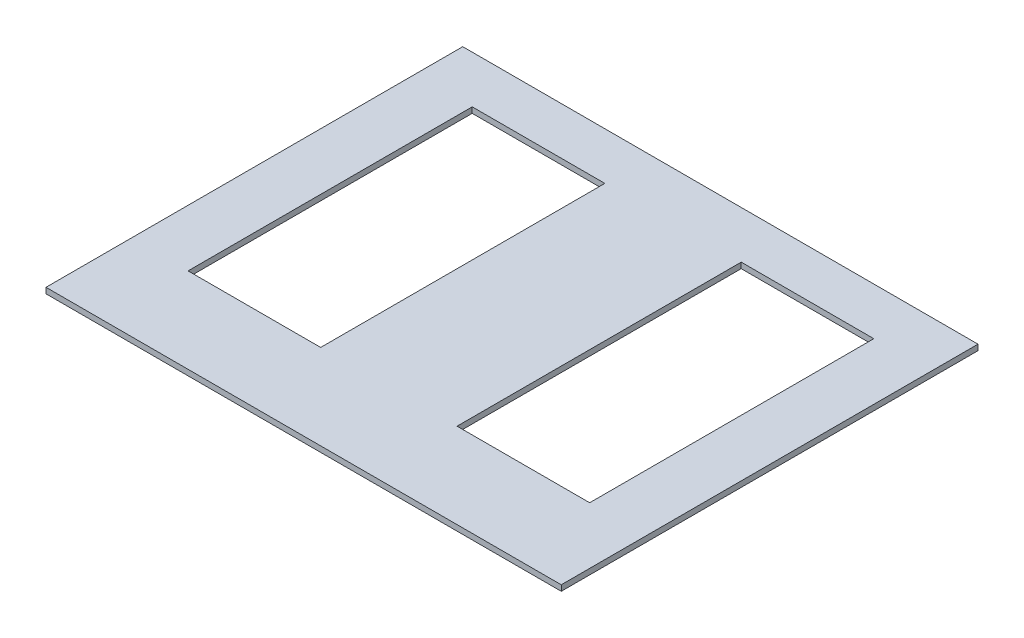
ISO-10303-21;
HEADER;
FILE_DESCRIPTION(('STEP AP214'),'2;1');
FILE_NAME('part.step','',(''),(''),'','','');
FILE_SCHEMA(('AUTOMOTIVE_DESIGN { 1 0 10303 214 1 1 1 1 }'));
ENDSEC;
DATA;
#1=APPLICATION_CONTEXT('core data for automotive mechanical design processes');
#2=APPLICATION_PROTOCOL_DEFINITION('international standard','automotive_design',2000,#1);
#3=PRODUCT_CONTEXT('',#1,'mechanical');
#4=PRODUCT('Part','Part','',(#3));
#5=PRODUCT_RELATED_PRODUCT_CATEGORY('part','',(#4));
#6=PRODUCT_DEFINITION_FORMATION('','',#4);
#7=PRODUCT_DEFINITION_CONTEXT('part definition',#1,'design');
#8=PRODUCT_DEFINITION('design','',#6,#7);
#9=PRODUCT_DEFINITION_SHAPE('','',#8);
#10=(LENGTH_UNIT() NAMED_UNIT(*) SI_UNIT(.MILLI.,.METRE.));
#11=(NAMED_UNIT(*) PLANE_ANGLE_UNIT() SI_UNIT($,.RADIAN.));
#12=(NAMED_UNIT(*) SI_UNIT($,.STERADIAN.) SOLID_ANGLE_UNIT());
#13=UNCERTAINTY_MEASURE_WITH_UNIT(LENGTH_MEASURE(1.E-05),#10,'distance_accuracy_value','');
#14=(GEOMETRIC_REPRESENTATION_CONTEXT(3) GLOBAL_UNCERTAINTY_ASSIGNED_CONTEXT((#13)) GLOBAL_UNIT_ASSIGNED_CONTEXT((#10,
#11,#12)) REPRESENTATION_CONTEXT('',''));
#15=CARTESIAN_POINT('',(0.,0.,0.));
#16=DIRECTION('',(0.,0.,1.));
#17=DIRECTION('',(1.,0.,0.));
#18=AXIS2_PLACEMENT_3D('',#15,#16,#17);
#19=CARTESIAN_POINT('',(-136.,3.,-110.));
#20=DIRECTION('',(1.,0.,0.));
#21=DIRECTION('',(0.,0.,-1.));
#22=AXIS2_PLACEMENT_3D('',#19,#20,#21);
#23=PLANE('',#22);
#24=DIRECTION('',(0.,0.,1.));
#25=VECTOR('',#24,1.);
#26=CARTESIAN_POINT('',(-136.,0.,-110.));
#27=LINE('',#26,#25);
#28=CARTESIAN_POINT('',(-136.,0.,-110.));
#29=VERTEX_POINT('',#28);
#30=CARTESIAN_POINT('',(-136.,0.,110.));
#31=VERTEX_POINT('',#30);
#32=EDGE_CURVE('E158',#29,#31,#27,.T.);
#33=ORIENTED_EDGE('',*,*,#32,.T.);
#34=DIRECTION('',(0.,-1.,0.));
#35=VECTOR('',#34,1.);
#36=CARTESIAN_POINT('',(-136.,3.,110.));
#37=LINE('',#36,#35);
#38=CARTESIAN_POINT('',(-136.,3.,110.));
#39=VERTEX_POINT('',#38);
#40=EDGE_CURVE('E11',#39,#31,#37,.T.);
#41=ORIENTED_EDGE('',*,*,#40,.F.);
#42=DIRECTION('',(0.,0.,1.));
#43=VECTOR('',#42,1.);
#44=CARTESIAN_POINT('',(-136.,3.,-110.));
#45=LINE('',#44,#43);
#46=CARTESIAN_POINT('',(-136.,3.,-110.));
#47=VERTEX_POINT('',#46);
#48=EDGE_CURVE('E191',#47,#39,#45,.T.);
#49=ORIENTED_EDGE('',*,*,#48,.F.);
#50=DIRECTION('',(0.,-1.,0.));
#51=VECTOR('',#50,1.);
#52=CARTESIAN_POINT('',(-136.,3.,-110.));
#53=LINE('',#52,#51);
#54=EDGE_CURVE('E201',#47,#29,#53,.T.);
#55=ORIENTED_EDGE('',*,*,#54,.T.);
#56=EDGE_LOOP('',(#33,#41,#49,#55));
#57=FACE_BOUND('',#56,.T.);
#58=ADVANCED_FACE('F33',(#57),#23,.F.);
#59=CARTESIAN_POINT('',(136.,3.,110.));
#60=DIRECTION('',(0.,0.,-1.));
#61=DIRECTION('',(-1.,0.,0.));
#62=AXIS2_PLACEMENT_3D('',#59,#60,#61);
#63=PLANE('',#62);
#64=DIRECTION('',(1.,0.,0.));
#65=VECTOR('',#64,1.);
#66=CARTESIAN_POINT('',(136.,0.,110.));
#67=LINE('',#66,#65);
#68=CARTESIAN_POINT('',(136.,0.,110.));
#69=VERTEX_POINT('',#68);
#70=EDGE_CURVE('E204',#31,#69,#67,.T.);
#71=ORIENTED_EDGE('',*,*,#70,.T.);
#72=DIRECTION('',(0.,-1.,0.));
#73=VECTOR('',#72,1.);
#74=CARTESIAN_POINT('',(136.,3.,110.));
#75=LINE('',#74,#73);
#76=CARTESIAN_POINT('',(136.,3.,110.));
#77=VERTEX_POINT('',#76);
#78=EDGE_CURVE('E40',#77,#69,#75,.T.);
#79=ORIENTED_EDGE('',*,*,#78,.F.);
#80=DIRECTION('',(1.,0.,0.));
#81=VECTOR('',#80,1.);
#82=CARTESIAN_POINT('',(136.,3.,110.));
#83=LINE('',#82,#81);
#84=EDGE_CURVE('E194',#39,#77,#83,.T.);
#85=ORIENTED_EDGE('',*,*,#84,.F.);
#86=ORIENTED_EDGE('',*,*,#40,.T.);
#87=EDGE_LOOP('',(#71,#79,#85,#86));
#88=FACE_BOUND('',#87,.T.);
#89=ADVANCED_FACE('F233',(#88),#63,.F.);
#90=CARTESIAN_POINT('',(136.,3.,-110.));
#91=DIRECTION('',(-1.,0.,0.));
#92=DIRECTION('',(0.,0.,1.));
#93=AXIS2_PLACEMENT_3D('',#90,#91,#92);
#94=PLANE('',#93);
#95=DIRECTION('',(0.,0.,-1.));
#96=VECTOR('',#95,1.);
#97=CARTESIAN_POINT('',(136.,0.,-110.));
#98=LINE('',#97,#96);
#99=CARTESIAN_POINT('',(136.,0.,-110.));
#100=VERTEX_POINT('',#99);
#101=EDGE_CURVE('E206',#69,#100,#98,.T.);
#102=ORIENTED_EDGE('',*,*,#101,.T.);
#103=DIRECTION('',(0.,-1.,0.));
#104=VECTOR('',#103,1.);
#105=CARTESIAN_POINT('',(136.,3.,-110.));
#106=LINE('',#105,#104);
#107=CARTESIAN_POINT('',(136.,3.,-110.));
#108=VERTEX_POINT('',#107);
#109=EDGE_CURVE('E211',#108,#100,#106,.T.);
#110=ORIENTED_EDGE('',*,*,#109,.F.);
#111=DIRECTION('',(0.,0.,-1.));
#112=VECTOR('',#111,1.);
#113=CARTESIAN_POINT('',(136.,3.,-110.));
#114=LINE('',#113,#112);
#115=EDGE_CURVE('E197',#77,#108,#114,.T.);
#116=ORIENTED_EDGE('',*,*,#115,.F.);
#117=ORIENTED_EDGE('',*,*,#78,.T.);
#118=EDGE_LOOP('',(#102,#110,#116,#117));
#119=FACE_BOUND('',#118,.T.);
#120=ADVANCED_FACE('F218',(#119),#94,.F.);
#121=CARTESIAN_POINT('',(136.,3.,-110.));
#122=DIRECTION('',(0.,0.,1.));
#123=DIRECTION('',(1.,0.,0.));
#124=AXIS2_PLACEMENT_3D('',#121,#122,#123);
#125=PLANE('',#124);
#126=DIRECTION('',(-1.,0.,0.));
#127=VECTOR('',#126,1.);
#128=CARTESIAN_POINT('',(136.,0.,-110.));
#129=LINE('',#128,#127);
#130=EDGE_CURVE('E195',#100,#29,#129,.T.);
#131=ORIENTED_EDGE('',*,*,#130,.T.);
#132=ORIENTED_EDGE('',*,*,#54,.F.);
#133=DIRECTION('',(-1.,0.,0.));
#134=VECTOR('',#133,1.);
#135=CARTESIAN_POINT('',(136.,3.,-110.));
#136=LINE('',#135,#134);
#137=EDGE_CURVE('E199',#108,#47,#136,.T.);
#138=ORIENTED_EDGE('',*,*,#137,.F.);
#139=ORIENTED_EDGE('',*,*,#109,.T.);
#140=EDGE_LOOP('',(#131,#132,#138,#139));
#141=FACE_BOUND('',#140,.T.);
#142=ADVANCED_FACE('F226',(#141),#125,.F.);
#143=CARTESIAN_POINT('',(0.,3.,0.));
#144=DIRECTION('',(0.,-1.,0.));
#145=DIRECTION('',(0.,0.,-1.));
#146=AXIS2_PLACEMENT_3D('',#143,#144,#145);
#147=PLANE('',#146);
#148=DIRECTION('',(-1.,0.,0.));
#149=VECTOR('',#148,1.);
#150=CARTESIAN_POINT('',(-106.,3.,-85.));
#151=LINE('',#150,#149);
#152=CARTESIAN_POINT('',(-35.9999999999999,3.,-85.));
#153=VERTEX_POINT('',#152);
#154=CARTESIAN_POINT('',(-106.,3.,-85.));
#155=VERTEX_POINT('',#154);
#156=EDGE_CURVE('E151',#153,#155,#151,.T.);
#157=ORIENTED_EDGE('',*,*,#156,.F.);
#158=DIRECTION('',(0.,0.,-1.));
#159=VECTOR('',#158,1.);
#160=CARTESIAN_POINT('',(-35.9999999999999,3.,-85.));
#161=LINE('',#160,#159);
#162=CARTESIAN_POINT('',(-35.9999999999999,3.,65.));
#163=VERTEX_POINT('',#162);
#164=EDGE_CURVE('E47',#163,#153,#161,.T.);
#165=ORIENTED_EDGE('',*,*,#164,.F.);
#166=DIRECTION('',(1.,0.,0.));
#167=VECTOR('',#166,1.);
#168=CARTESIAN_POINT('',(-106.,3.,65.));
#169=LINE('',#168,#167);
#170=CARTESIAN_POINT('',(-106.,3.,65.));
#171=VERTEX_POINT('',#170);
#172=EDGE_CURVE('E142',#171,#163,#169,.T.);
#173=ORIENTED_EDGE('',*,*,#172,.F.);
#174=DIRECTION('',(0.,0.,1.));
#175=VECTOR('',#174,1.);
#176=CARTESIAN_POINT('',(-106.,3.,-85.));
#177=LINE('',#176,#175);
#178=EDGE_CURVE('E145',#155,#171,#177,.T.);
#179=ORIENTED_EDGE('',*,*,#178,.F.);
#180=EDGE_LOOP('',(#157,#165,#173,#179));
#181=FACE_BOUND('',#180,.T.);
#182=DIRECTION('',(-1.,0.,0.));
#183=VECTOR('',#182,1.);
#184=CARTESIAN_POINT('',(106.,3.,-85.));
#185=LINE('',#184,#183);
#186=CARTESIAN_POINT('',(106.,3.,-85.));
#187=VERTEX_POINT('',#186);
#188=CARTESIAN_POINT('',(35.9999999999999,3.,-85.));
#189=VERTEX_POINT('',#188);
#190=EDGE_CURVE('E177',#187,#189,#185,.T.);
#191=ORIENTED_EDGE('',*,*,#190,.F.);
#192=DIRECTION('',(0.,0.,-1.));
#193=VECTOR('',#192,1.);
#194=CARTESIAN_POINT('',(106.,3.,-85.));
#195=LINE('',#194,#193);
#196=CARTESIAN_POINT('',(106.,3.,65.));
#197=VERTEX_POINT('',#196);
#198=EDGE_CURVE('E55',#197,#187,#195,.T.);
#199=ORIENTED_EDGE('',*,*,#198,.F.);
#200=DIRECTION('',(1.,0.,0.));
#201=VECTOR('',#200,1.);
#202=CARTESIAN_POINT('',(106.,3.,65.));
#203=LINE('',#202,#201);
#204=CARTESIAN_POINT('',(36.,3.,65.));
#205=VERTEX_POINT('',#204);
#206=EDGE_CURVE('E166',#205,#197,#203,.T.);
#207=ORIENTED_EDGE('',*,*,#206,.F.);
#208=DIRECTION('',(0.,0.,1.));
#209=VECTOR('',#208,1.);
#210=CARTESIAN_POINT('',(35.9999999999999,3.,-85.));
#211=LINE('',#210,#209);
#212=EDGE_CURVE('E180',#189,#205,#211,.T.);
#213=ORIENTED_EDGE('',*,*,#212,.F.);
#214=EDGE_LOOP('',(#191,#199,#207,#213));
#215=FACE_BOUND('',#214,.T.);
#216=ORIENTED_EDGE('',*,*,#48,.T.);
#217=ORIENTED_EDGE('',*,*,#84,.T.);
#218=ORIENTED_EDGE('',*,*,#115,.T.);
#219=ORIENTED_EDGE('',*,*,#137,.T.);
#220=EDGE_LOOP('',(#216,#217,#218,#219));
#221=FACE_BOUND('',#220,.T.);
#222=ADVANCED_FACE('F232',(#181,#215,#221),#147,.F.);
#223=CARTESIAN_POINT('',(0.,0.,0.));
#224=DIRECTION('',(0.,-1.,0.));
#225=DIRECTION('',(0.,0.,-1.));
#226=AXIS2_PLACEMENT_3D('',#223,#224,#225);
#227=PLANE('',#226);
#228=DIRECTION('',(0.,0.,-1.));
#229=VECTOR('',#228,1.);
#230=CARTESIAN_POINT('',(-35.9999999999999,0.,-85.));
#231=LINE('',#230,#229);
#232=CARTESIAN_POINT('',(-35.9999999999999,0.,65.));
#233=VERTEX_POINT('',#232);
#234=CARTESIAN_POINT('',(-35.9999999999999,0.,-85.));
#235=VERTEX_POINT('',#234);
#236=EDGE_CURVE('E123',#233,#235,#231,.T.);
#237=ORIENTED_EDGE('',*,*,#236,.T.);
#238=DIRECTION('',(-1.,0.,0.));
#239=VECTOR('',#238,1.);
#240=CARTESIAN_POINT('',(-106.,0.,-85.));
#241=LINE('',#240,#239);
#242=CARTESIAN_POINT('',(-106.,0.,-85.));
#243=VERTEX_POINT('',#242);
#244=EDGE_CURVE('E133',#235,#243,#241,.T.);
#245=ORIENTED_EDGE('',*,*,#244,.T.);
#246=DIRECTION('',(0.,0.,1.));
#247=VECTOR('',#246,1.);
#248=CARTESIAN_POINT('',(-106.,0.,-85.));
#249=LINE('',#248,#247);
#250=CARTESIAN_POINT('',(-106.,0.,65.));
#251=VERTEX_POINT('',#250);
#252=EDGE_CURVE('E137',#243,#251,#249,.T.);
#253=ORIENTED_EDGE('',*,*,#252,.T.);
#254=DIRECTION('',(1.,0.,0.));
#255=VECTOR('',#254,1.);
#256=CARTESIAN_POINT('',(-106.,0.,65.));
#257=LINE('',#256,#255);
#258=EDGE_CURVE('E129',#251,#233,#257,.T.);
#259=ORIENTED_EDGE('',*,*,#258,.T.);
#260=EDGE_LOOP('',(#237,#245,#253,#259));
#261=FACE_BOUND('',#260,.T.);
#262=DIRECTION('',(0.,0.,-1.));
#263=VECTOR('',#262,1.);
#264=CARTESIAN_POINT('',(106.,0.,-85.));
#265=LINE('',#264,#263);
#266=CARTESIAN_POINT('',(106.,0.,65.));
#267=VERTEX_POINT('',#266);
#268=CARTESIAN_POINT('',(106.,0.,-85.));
#269=VERTEX_POINT('',#268);
#270=EDGE_CURVE('E162',#267,#269,#265,.T.);
#271=ORIENTED_EDGE('',*,*,#270,.T.);
#272=DIRECTION('',(-1.,0.,0.));
#273=VECTOR('',#272,1.);
#274=CARTESIAN_POINT('',(106.,0.,-85.));
#275=LINE('',#274,#273);
#276=CARTESIAN_POINT('',(35.9999999999999,0.,-85.));
#277=VERTEX_POINT('',#276);
#278=EDGE_CURVE('E165',#269,#277,#275,.T.);
#279=ORIENTED_EDGE('',*,*,#278,.T.);
#280=DIRECTION('',(0.,0.,1.));
#281=VECTOR('',#280,1.);
#282=CARTESIAN_POINT('',(35.9999999999999,0.,-85.));
#283=LINE('',#282,#281);
#284=CARTESIAN_POINT('',(36.,0.,65.));
#285=VERTEX_POINT('',#284);
#286=EDGE_CURVE('E169',#277,#285,#283,.T.);
#287=ORIENTED_EDGE('',*,*,#286,.T.);
#288=DIRECTION('',(1.,0.,0.));
#289=VECTOR('',#288,1.);
#290=CARTESIAN_POINT('',(106.,0.,65.));
#291=LINE('',#290,#289);
#292=EDGE_CURVE('E172',#285,#267,#291,.T.);
#293=ORIENTED_EDGE('',*,*,#292,.T.);
#294=EDGE_LOOP('',(#271,#279,#287,#293));
#295=FACE_BOUND('',#294,.T.);
#296=ORIENTED_EDGE('',*,*,#32,.F.);
#297=ORIENTED_EDGE('',*,*,#130,.F.);
#298=ORIENTED_EDGE('',*,*,#101,.F.);
#299=ORIENTED_EDGE('',*,*,#70,.F.);
#300=EDGE_LOOP('',(#296,#297,#298,#299));
#301=FACE_BOUND('',#300,.T.);
#302=ADVANCED_FACE('F139',(#261,#295,#301),#227,.T.);
#303=CARTESIAN_POINT('',(106.,0.,-85.));
#304=DIRECTION('',(1.,0.,0.));
#305=DIRECTION('',(0.,0.,-1.));
#306=AXIS2_PLACEMENT_3D('',#303,#304,#305);
#307=PLANE('',#306);
#308=ORIENTED_EDGE('',*,*,#198,.T.);
#309=DIRECTION('',(0.,1.,0.));
#310=VECTOR('',#309,1.);
#311=CARTESIAN_POINT('',(106.,0.,-85.));
#312=LINE('',#311,#310);
#313=EDGE_CURVE('E175',#269,#187,#312,.T.);
#314=ORIENTED_EDGE('',*,*,#313,.F.);
#315=ORIENTED_EDGE('',*,*,#270,.F.);
#316=DIRECTION('',(0.,1.,0.));
#317=VECTOR('',#316,1.);
#318=CARTESIAN_POINT('',(106.,0.,65.));
#319=LINE('',#318,#317);
#320=EDGE_CURVE('E152',#267,#197,#319,.T.);
#321=ORIENTED_EDGE('',*,*,#320,.T.);
#322=EDGE_LOOP('',(#308,#314,#315,#321));
#323=FACE_BOUND('',#322,.T.);
#324=ADVANCED_FACE('F245',(#323),#307,.F.);
#325=CARTESIAN_POINT('',(106.,0.,65.));
#326=DIRECTION('',(0.,0.,1.));
#327=DIRECTION('',(1.,0.,0.));
#328=AXIS2_PLACEMENT_3D('',#325,#326,#327);
#329=PLANE('',#328);
#330=ORIENTED_EDGE('',*,*,#206,.T.);
#331=ORIENTED_EDGE('',*,*,#320,.F.);
#332=ORIENTED_EDGE('',*,*,#292,.F.);
#333=DIRECTION('',(0.,1.,0.));
#334=VECTOR('',#333,1.);
#335=CARTESIAN_POINT('',(36.,0.,65.));
#336=LINE('',#335,#334);
#337=EDGE_CURVE('E186',#285,#205,#336,.T.);
#338=ORIENTED_EDGE('',*,*,#337,.T.);
#339=EDGE_LOOP('',(#330,#331,#332,#338));
#340=FACE_BOUND('',#339,.T.);
#341=ADVANCED_FACE('F251',(#340),#329,.F.);
#342=CARTESIAN_POINT('',(35.9999999999999,0.,-85.));
#343=DIRECTION('',(-1.,0.,0.));
#344=DIRECTION('',(0.,0.,1.));
#345=AXIS2_PLACEMENT_3D('',#342,#343,#344);
#346=PLANE('',#345);
#347=ORIENTED_EDGE('',*,*,#212,.T.);
#348=ORIENTED_EDGE('',*,*,#337,.F.);
#349=ORIENTED_EDGE('',*,*,#286,.F.);
#350=DIRECTION('',(0.,1.,0.));
#351=VECTOR('',#350,1.);
#352=CARTESIAN_POINT('',(35.9999999999999,0.,-85.));
#353=LINE('',#352,#351);
#354=EDGE_CURVE('E188',#277,#189,#353,.T.);
#355=ORIENTED_EDGE('',*,*,#354,.T.);
#356=EDGE_LOOP('',(#347,#348,#349,#355));
#357=FACE_BOUND('',#356,.T.);
#358=ADVANCED_FACE('F255',(#357),#346,.F.);
#359=CARTESIAN_POINT('',(106.,0.,-85.));
#360=DIRECTION('',(0.,0.,-1.));
#361=DIRECTION('',(-1.,0.,0.));
#362=AXIS2_PLACEMENT_3D('',#359,#360,#361);
#363=PLANE('',#362);
#364=ORIENTED_EDGE('',*,*,#190,.T.);
#365=ORIENTED_EDGE('',*,*,#354,.F.);
#366=ORIENTED_EDGE('',*,*,#278,.F.);
#367=ORIENTED_EDGE('',*,*,#313,.T.);
#368=EDGE_LOOP('',(#364,#365,#366,#367));
#369=FACE_BOUND('',#368,.T.);
#370=ADVANCED_FACE('F252',(#369),#363,.F.);
#371=CARTESIAN_POINT('',(-35.9999999999999,0.,-85.));
#372=DIRECTION('',(1.,0.,0.));
#373=DIRECTION('',(0.,0.,-1.));
#374=AXIS2_PLACEMENT_3D('',#371,#372,#373);
#375=PLANE('',#374);
#376=ORIENTED_EDGE('',*,*,#164,.T.);
#377=DIRECTION('',(0.,1.,0.));
#378=VECTOR('',#377,1.);
#379=CARTESIAN_POINT('',(-35.9999999999999,0.,-85.));
#380=LINE('',#379,#378);
#381=EDGE_CURVE('E119',#235,#153,#380,.T.);
#382=ORIENTED_EDGE('',*,*,#381,.F.);
#383=ORIENTED_EDGE('',*,*,#236,.F.);
#384=DIRECTION('',(0.,1.,0.));
#385=VECTOR('',#384,1.);
#386=CARTESIAN_POINT('',(-35.9999999999999,0.,65.));
#387=LINE('',#386,#385);
#388=EDGE_CURVE('E156',#233,#163,#387,.T.);
#389=ORIENTED_EDGE('',*,*,#388,.T.);
#390=EDGE_LOOP('',(#376,#382,#383,#389));
#391=FACE_BOUND('',#390,.T.);
#392=ADVANCED_FACE('F121',(#391),#375,.F.);
#393=CARTESIAN_POINT('',(-106.,0.,65.));
#394=DIRECTION('',(0.,0.,1.));
#395=DIRECTION('',(1.,0.,0.));
#396=AXIS2_PLACEMENT_3D('',#393,#394,#395);
#397=PLANE('',#396);
#398=ORIENTED_EDGE('',*,*,#172,.T.);
#399=ORIENTED_EDGE('',*,*,#388,.F.);
#400=ORIENTED_EDGE('',*,*,#258,.F.);
#401=DIRECTION('',(0.,1.,0.));
#402=VECTOR('',#401,1.);
#403=CARTESIAN_POINT('',(-106.,0.,65.));
#404=LINE('',#403,#402);
#405=EDGE_CURVE('E159',#251,#171,#404,.T.);
#406=ORIENTED_EDGE('',*,*,#405,.T.);
#407=EDGE_LOOP('',(#398,#399,#400,#406));
#408=FACE_BOUND('',#407,.T.);
#409=ADVANCED_FACE('F265',(#408),#397,.F.);
#410=CARTESIAN_POINT('',(-106.,0.,-85.));
#411=DIRECTION('',(-1.,0.,0.));
#412=DIRECTION('',(0.,0.,1.));
#413=AXIS2_PLACEMENT_3D('',#410,#411,#412);
#414=PLANE('',#413);
#415=ORIENTED_EDGE('',*,*,#178,.T.);
#416=ORIENTED_EDGE('',*,*,#405,.F.);
#417=ORIENTED_EDGE('',*,*,#252,.F.);
#418=DIRECTION('',(0.,1.,0.));
#419=VECTOR('',#418,1.);
#420=CARTESIAN_POINT('',(-106.,0.,-85.));
#421=LINE('',#420,#419);
#422=EDGE_CURVE('E128',#243,#155,#421,.T.);
#423=ORIENTED_EDGE('',*,*,#422,.T.);
#424=EDGE_LOOP('',(#415,#416,#417,#423));
#425=FACE_BOUND('',#424,.T.);
#426=ADVANCED_FACE('F268',(#425),#414,.F.);
#427=CARTESIAN_POINT('',(-106.,0.,-85.));
#428=DIRECTION('',(0.,0.,-1.));
#429=DIRECTION('',(-1.,0.,0.));
#430=AXIS2_PLACEMENT_3D('',#427,#428,#429);
#431=PLANE('',#430);
#432=ORIENTED_EDGE('',*,*,#156,.T.);
#433=ORIENTED_EDGE('',*,*,#422,.F.);
#434=ORIENTED_EDGE('',*,*,#244,.F.);
#435=ORIENTED_EDGE('',*,*,#381,.T.);
#436=EDGE_LOOP('',(#432,#433,#434,#435));
#437=FACE_BOUND('',#436,.T.);
#438=ADVANCED_FACE('F134',(#437),#431,.F.);
#439=CLOSED_SHELL('',(#58,#89,#120,#142,#222,#302,#324,#341,#358,#370,#392,#409,#426,#438));
#440=MANIFOLD_SOLID_BREP('B2',#439);
#441=ADVANCED_BREP_SHAPE_REPRESENTATION('',(#18,#440),#14);
#442=SHAPE_DEFINITION_REPRESENTATION(#9,#441);
ENDSEC;
END-ISO-10303-21;
